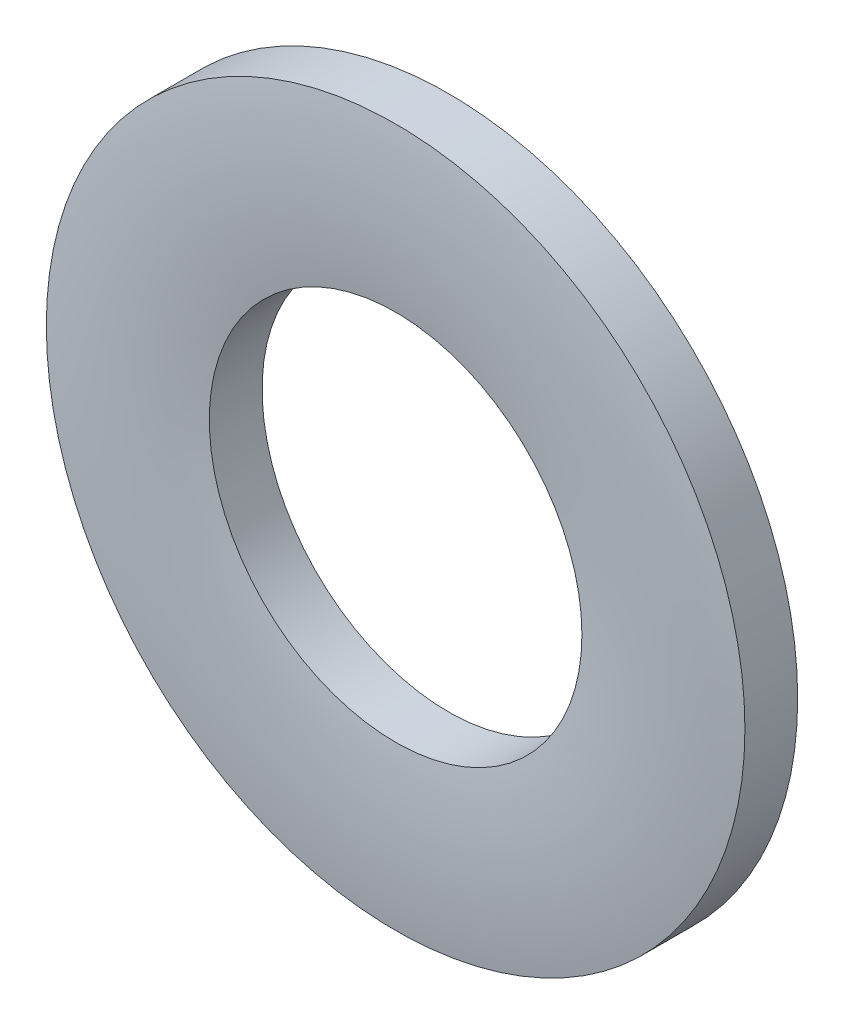
ISO-10303-21;
HEADER;
FILE_DESCRIPTION(('STEP AP214'),'2;1');
FILE_NAME('part.step','',(''),(''),'','','');
FILE_SCHEMA(('AUTOMOTIVE_DESIGN { 1 0 10303 214 1 1 1 1 }'));
ENDSEC;
DATA;
#1=APPLICATION_CONTEXT('core data for automotive mechanical design processes');
#2=APPLICATION_PROTOCOL_DEFINITION('international standard','automotive_design',2000,#1);
#3=PRODUCT_CONTEXT('',#1,'mechanical');
#4=PRODUCT('Part','Part','',(#3));
#5=PRODUCT_RELATED_PRODUCT_CATEGORY('part','',(#4));
#6=PRODUCT_DEFINITION_FORMATION('','',#4);
#7=PRODUCT_DEFINITION_CONTEXT('part definition',#1,'design');
#8=PRODUCT_DEFINITION('design','',#6,#7);
#9=PRODUCT_DEFINITION_SHAPE('','',#8);
#10=(LENGTH_UNIT() NAMED_UNIT(*) SI_UNIT(.MILLI.,.METRE.));
#11=(NAMED_UNIT(*) PLANE_ANGLE_UNIT() SI_UNIT($,.RADIAN.));
#12=(NAMED_UNIT(*) SI_UNIT($,.STERADIAN.) SOLID_ANGLE_UNIT());
#13=UNCERTAINTY_MEASURE_WITH_UNIT(LENGTH_MEASURE(1.E-05),#10,'distance_accuracy_value','');
#14=(GEOMETRIC_REPRESENTATION_CONTEXT(3) GLOBAL_UNCERTAINTY_ASSIGNED_CONTEXT((#13)) GLOBAL_UNIT_ASSIGNED_CONTEXT((#10,
#11,#12)) REPRESENTATION_CONTEXT('',''));
#15=CARTESIAN_POINT('',(0.,0.,0.));
#16=DIRECTION('',(0.,0.,1.));
#17=DIRECTION('',(1.,0.,0.));
#18=AXIS2_PLACEMENT_3D('',#15,#16,#17);
#19=CARTESIAN_POINT('',(0.,1.6,-0.25));
#20=DIRECTION('',(0.,0.,1.));
#21=DIRECTION('',(1.,0.,0.));
#22=AXIS2_PLACEMENT_3D('',#19,#20,#21);
#23=PLANE('',#22);
#24=CARTESIAN_POINT('',(0.,0.,-0.25));
#25=DIRECTION('',(0.,0.,1.));
#26=DIRECTION('',(1.,0.,0.));
#27=AXIS2_PLACEMENT_3D('',#24,#25,#26);
#28=CIRCLE('',#27,3.);
#29=CARTESIAN_POINT('',(3.,0.,-0.25));
#30=VERTEX_POINT('',#29);
#31=EDGE_CURVE('E46',#30,#30,#28,.T.);
#32=ORIENTED_EDGE('',*,*,#31,.F.);
#33=EDGE_LOOP('',(#32));
#34=FACE_BOUND('',#33,.T.);
#35=CARTESIAN_POINT('',(0.,0.,-0.25));
#36=DIRECTION('',(0.,0.,1.));
#37=DIRECTION('',(1.,0.,0.));
#38=AXIS2_PLACEMENT_3D('',#35,#36,#37);
#39=CIRCLE('',#38,1.6);
#40=CARTESIAN_POINT('',(1.6,0.,-0.25));
#41=VERTEX_POINT('',#40);
#42=EDGE_CURVE('E10',#41,#41,#39,.T.);
#43=ORIENTED_EDGE('',*,*,#42,.T.);
#44=EDGE_LOOP('',(#43));
#45=FACE_BOUND('',#44,.T.);
#46=ADVANCED_FACE('F32',(#34,#45),#23,.F.);
#47=CARTESIAN_POINT('',(0.,0.,0.25));
#48=DIRECTION('',(0.,0.,1.));
#49=DIRECTION('',(1.,0.,0.));
#50=AXIS2_PLACEMENT_3D('',#47,#48,#49);
#51=CYLINDRICAL_SURFACE('',#50,1.6);
#52=ORIENTED_EDGE('',*,*,#42,.F.);
#53=EDGE_LOOP('',(#52));
#54=FACE_BOUND('',#53,.T.);
#55=CARTESIAN_POINT('',(0.,0.,0.20315));
#56=DIRECTION('',(0.,0.,1.));
#57=DIRECTION('',(1.,0.,0.));
#58=AXIS2_PLACEMENT_3D('',#55,#56,#57);
#59=CIRCLE('',#58,1.6);
#60=CARTESIAN_POINT('',(1.6,0.,0.20315));
#61=VERTEX_POINT('',#60);
#62=EDGE_CURVE('E38',#61,#61,#59,.T.);
#63=ORIENTED_EDGE('',*,*,#62,.T.);
#64=EDGE_LOOP('',(#63));
#65=FACE_BOUND('',#64,.T.);
#66=ADVANCED_FACE('F55',(#54,#65),#51,.F.);
#67=CARTESIAN_POINT('',(0.,0.,-5.00288070971186));
#68=DIRECTION('',(0.,0.,1.));
#69=DIRECTION('',(1.,0.,0.));
#70=AXIS2_PLACEMENT_3D('',#67,#68,#69);
#71=DEGENERATE_TOROIDAL_SURFACE('',#70,2.3,5.25288070971186,.T.);
#72=ORIENTED_EDGE('',*,*,#62,.F.);
#73=EDGE_LOOP('',(#72));
#74=FACE_BOUND('',#73,.T.);
#75=CARTESIAN_POINT('',(0.,0.,0.20315));
#76=DIRECTION('',(0.,0.,1.));
#77=DIRECTION('',(1.,0.,0.));
#78=AXIS2_PLACEMENT_3D('',#75,#76,#77);
#79=CIRCLE('',#78,3.);
#80=CARTESIAN_POINT('',(3.,0.,0.20315));
#81=VERTEX_POINT('',#80);
#82=EDGE_CURVE('E42',#81,#81,#79,.T.);
#83=ORIENTED_EDGE('',*,*,#82,.T.);
#84=EDGE_LOOP('',(#83));
#85=FACE_BOUND('',#84,.T.);
#86=ADVANCED_FACE('F59',(#74,#85),#71,.T.);
#87=CARTESIAN_POINT('',(0.,0.,0.25));
#88=DIRECTION('',(0.,0.,1.));
#89=DIRECTION('',(1.,0.,0.));
#90=AXIS2_PLACEMENT_3D('',#87,#88,#89);
#91=CYLINDRICAL_SURFACE('',#90,3.);
#92=ORIENTED_EDGE('',*,*,#82,.F.);
#93=EDGE_LOOP('',(#92));
#94=FACE_BOUND('',#93,.T.);
#95=ORIENTED_EDGE('',*,*,#31,.T.);
#96=EDGE_LOOP('',(#95));
#97=FACE_BOUND('',#96,.T.);
#98=ADVANCED_FACE('F52',(#94,#97),#91,.T.);
#99=CLOSED_SHELL('',(#46,#66,#86,#98));
#100=MANIFOLD_SOLID_BREP('B2',#99);
#101=ADVANCED_BREP_SHAPE_REPRESENTATION('',(#18,#100),#14);
#102=SHAPE_DEFINITION_REPRESENTATION(#9,#101);
ENDSEC;
END-ISO-10303-21;
